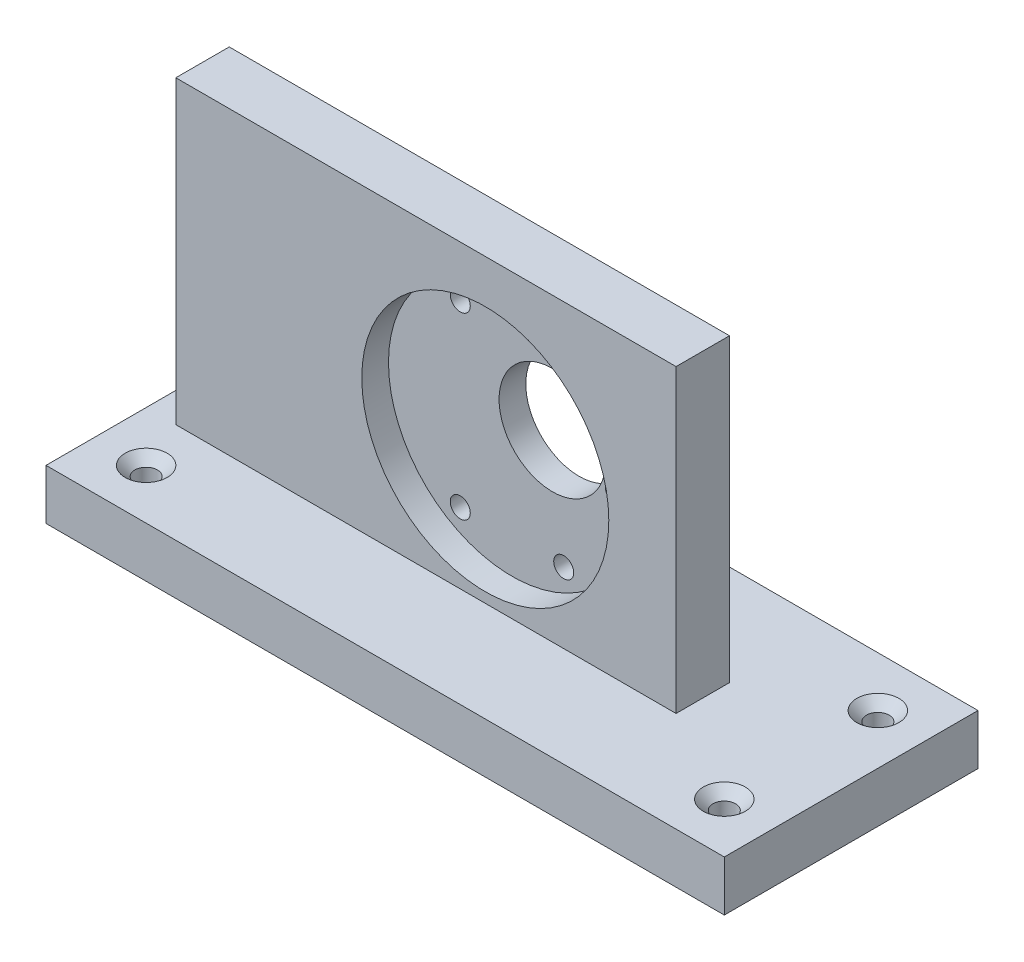
ISO-10303-21;
HEADER;
FILE_DESCRIPTION(('STEP AP214'),'2;1');
FILE_NAME('part.step','',(''),(''),'','','');
FILE_SCHEMA(('AUTOMOTIVE_DESIGN { 1 0 10303 214 1 1 1 1 }'));
ENDSEC;
DATA;
#1=APPLICATION_CONTEXT('core data for automotive mechanical design processes');
#2=APPLICATION_PROTOCOL_DEFINITION('international standard','automotive_design',2000,#1);
#3=PRODUCT_CONTEXT('',#1,'mechanical');
#4=PRODUCT('Part','Part','',(#3));
#5=PRODUCT_RELATED_PRODUCT_CATEGORY('part','',(#4));
#6=PRODUCT_DEFINITION_FORMATION('','',#4);
#7=PRODUCT_DEFINITION_CONTEXT('part definition',#1,'design');
#8=PRODUCT_DEFINITION('design','',#6,#7);
#9=PRODUCT_DEFINITION_SHAPE('','',#8);
#10=(LENGTH_UNIT() NAMED_UNIT(*) SI_UNIT(.MILLI.,.METRE.));
#11=(NAMED_UNIT(*) PLANE_ANGLE_UNIT() SI_UNIT($,.RADIAN.));
#12=(NAMED_UNIT(*) SI_UNIT($,.STERADIAN.) SOLID_ANGLE_UNIT());
#13=UNCERTAINTY_MEASURE_WITH_UNIT(LENGTH_MEASURE(1.E-05),#10,'distance_accuracy_value','');
#14=(GEOMETRIC_REPRESENTATION_CONTEXT(3) GLOBAL_UNCERTAINTY_ASSIGNED_CONTEXT((#13)) GLOBAL_UNIT_ASSIGNED_CONTEXT((#10,
#11,#12)) REPRESENTATION_CONTEXT('',''));
#15=CARTESIAN_POINT('',(0.,0.,0.));
#16=DIRECTION('',(0.,0.,1.));
#17=DIRECTION('',(1.,0.,0.));
#18=AXIS2_PLACEMENT_3D('',#15,#16,#17);
#19=CARTESIAN_POINT('',(-50.8,5.,23.));
#20=DIRECTION('',(0.,-1.,0.));
#21=DIRECTION('',(1.,0.,0.));
#22=AXIS2_PLACEMENT_3D('',#19,#20,#21);
#23=PLANE('',#22);
#24=DIRECTION('',(-1.,0.,0.));
#25=VECTOR('',#24,1.);
#26=CARTESIAN_POINT('',(-50.8,5.,-15.));
#27=LINE('',#26,#25);
#28=CARTESIAN_POINT('',(50.8,5.00000000000002,-15.));
#29=VERTEX_POINT('',#28);
#30=CARTESIAN_POINT('',(-25.7177120902274,5.00000000000001,-15.));
#31=VERTEX_POINT('',#30);
#32=EDGE_CURVE('E285',#29,#31,#27,.T.);
#33=ORIENTED_EDGE('',*,*,#32,.T.);
#34=DIRECTION('',(0.,0.,-1.));
#35=VECTOR('',#34,1.);
#36=CARTESIAN_POINT('',(-25.7177120902274,5.00000000000001,-15.));
#37=LINE('',#36,#35);
#38=CARTESIAN_POINT('',(-25.7177120902274,5.00000000000001,-3.01915184565478));
#39=VERTEX_POINT('',#38);
#40=EDGE_CURVE('E235',#39,#31,#37,.T.);
#41=ORIENTED_EDGE('',*,*,#40,.F.);
#42=DIRECTION('',(1.,0.,0.));
#43=VECTOR('',#42,1.);
#44=CARTESIAN_POINT('',(-50.8,5.,-3.01915184565478));
#45=LINE('',#44,#43);
#46=CARTESIAN_POINT('',(-50.8,5.,-3.01915184565478));
#47=VERTEX_POINT('',#46);
#48=EDGE_CURVE('E166',#47,#39,#45,.T.);
#49=ORIENTED_EDGE('',*,*,#48,.F.);
#50=DIRECTION('',(0.,0.,-1.));
#51=VECTOR('',#50,1.);
#52=CARTESIAN_POINT('',(-50.8,5.,23.));
#53=LINE('',#52,#51);
#54=CARTESIAN_POINT('',(-50.8,5.,23.));
#55=VERTEX_POINT('',#54);
#56=EDGE_CURVE('E298',#55,#47,#53,.T.);
#57=ORIENTED_EDGE('',*,*,#56,.F.);
#58=DIRECTION('',(-1.,0.,0.));
#59=VECTOR('',#58,1.);
#60=CARTESIAN_POINT('',(-50.8,5.,23.));
#61=LINE('',#60,#59);
#62=CARTESIAN_POINT('',(50.8,5.00000000000002,23.));
#63=VERTEX_POINT('',#62);
#64=EDGE_CURVE('E295',#63,#55,#61,.T.);
#65=ORIENTED_EDGE('',*,*,#64,.F.);
#66=DIRECTION('',(0.,0.,-1.));
#67=VECTOR('',#66,1.);
#68=CARTESIAN_POINT('',(50.8,5.00000000000002,23.));
#69=LINE('',#68,#67);
#70=EDGE_CURVE('E302',#63,#29,#69,.T.);
#71=ORIENTED_EDGE('',*,*,#70,.T.);
#72=EDGE_LOOP('',(#33,#41,#49,#57,#65,#71));
#73=FACE_BOUND('',#72,.T.);
#74=CARTESIAN_POINT('',(43.3,5.00000000000002,-7.50000000000001));
#75=DIRECTION('',(0.,1.,0.));
#76=DIRECTION('',(0.,0.,1.));
#77=AXIS2_PLACEMENT_3D('',#74,#75,#76);
#78=CIRCLE('',#77,3.15);
#79=CARTESIAN_POINT('',(43.3,5.00000000000002,-4.35000000000001));
#80=VERTEX_POINT('',#79);
#81=EDGE_CURVE('E269',#80,#80,#78,.T.);
#82=ORIENTED_EDGE('',*,*,#81,.F.);
#83=EDGE_LOOP('',(#82));
#84=FACE_BOUND('',#83,.T.);
#85=CARTESIAN_POINT('',(43.3,5.00000000000002,15.5));
#86=DIRECTION('',(0.,1.,0.));
#87=DIRECTION('',(0.,0.,1.));
#88=AXIS2_PLACEMENT_3D('',#85,#86,#87);
#89=CIRCLE('',#88,3.15);
#90=CARTESIAN_POINT('',(43.3,5.00000000000002,18.65));
#91=VERTEX_POINT('',#90);
#92=EDGE_CURVE('E257',#91,#91,#89,.T.);
#93=ORIENTED_EDGE('',*,*,#92,.F.);
#94=EDGE_LOOP('',(#93));
#95=FACE_BOUND('',#94,.T.);
#96=CARTESIAN_POINT('',(-43.3,5.,15.5));
#97=DIRECTION('',(0.,1.,0.));
#98=DIRECTION('',(0.,0.,1.));
#99=AXIS2_PLACEMENT_3D('',#96,#97,#98);
#100=CIRCLE('',#99,3.15);
#101=CARTESIAN_POINT('',(-43.3,5.,18.65));
#102=VERTEX_POINT('',#101);
#103=EDGE_CURVE('E245',#102,#102,#100,.T.);
#104=ORIENTED_EDGE('',*,*,#103,.F.);
#105=EDGE_LOOP('',(#104));
#106=FACE_BOUND('',#105,.T.);
#107=DIRECTION('',(0.,0.,1.));
#108=VECTOR('',#107,1.);
#109=CARTESIAN_POINT('',(-46.355,5.,8.));
#110=LINE('',#109,#108);
#111=CARTESIAN_POINT('',(-46.355,5.,0.));
#112=VERTEX_POINT('',#111);
#113=CARTESIAN_POINT('',(-46.355,5.,8.));
#114=VERTEX_POINT('',#113);
#115=EDGE_CURVE('E215',#112,#114,#110,.T.);
#116=ORIENTED_EDGE('',*,*,#115,.F.);
#117=DIRECTION('',(-1.,0.,0.));
#118=VECTOR('',#117,1.);
#119=CARTESIAN_POINT('',(0.,5.00000000000001,0.));
#120=LINE('',#119,#118);
#121=CARTESIAN_POINT('',(28.575,5.00000000000002,0.));
#122=VERTEX_POINT('',#121);
#123=EDGE_CURVE('E91',#122,#112,#120,.T.);
#124=ORIENTED_EDGE('',*,*,#123,.F.);
#125=DIRECTION('',(0.,0.,-1.));
#126=VECTOR('',#125,1.);
#127=CARTESIAN_POINT('',(28.575,5.00000000000001,8.));
#128=LINE('',#127,#126);
#129=CARTESIAN_POINT('',(28.575,5.00000000000001,8.));
#130=VERTEX_POINT('',#129);
#131=EDGE_CURVE('E305',#130,#122,#128,.T.);
#132=ORIENTED_EDGE('',*,*,#131,.F.);
#133=DIRECTION('',(-1.,0.,0.));
#134=VECTOR('',#133,1.);
#135=CARTESIAN_POINT('',(0.,5.00000000000001,8.));
#136=LINE('',#135,#134);
#137=EDGE_CURVE('E98',#130,#114,#136,.T.);
#138=ORIENTED_EDGE('',*,*,#137,.T.);
#139=EDGE_LOOP('',(#116,#124,#132,#138));
#140=FACE_BOUND('',#139,.T.);
#141=ADVANCED_FACE('F74',(#73,#84,#95,#106,#140),#23,.F.);
#142=CARTESIAN_POINT('',(28.575,50.,8.));
#143=DIRECTION('',(1.,0.,0.));
#144=DIRECTION('',(0.,1.,0.));
#145=AXIS2_PLACEMENT_3D('',#142,#143,#144);
#146=PLANE('',#145);
#147=DIRECTION('',(0.,-1.,0.));
#148=VECTOR('',#147,1.);
#149=CARTESIAN_POINT('',(28.575,50.,8.));
#150=LINE('',#149,#148);
#151=CARTESIAN_POINT('',(28.575,50.,8.));
#152=VERTEX_POINT('',#151);
#153=EDGE_CURVE('E369',#152,#130,#150,.T.);
#154=ORIENTED_EDGE('',*,*,#153,.T.);
#155=ORIENTED_EDGE('',*,*,#131,.T.);
#156=DIRECTION('',(0.,-1.,0.));
#157=VECTOR('',#156,1.);
#158=CARTESIAN_POINT('',(28.575,50.,0.));
#159=LINE('',#158,#157);
#160=CARTESIAN_POINT('',(28.575,50.,0.));
#161=VERTEX_POINT('',#160);
#162=EDGE_CURVE('E370',#161,#122,#159,.T.);
#163=ORIENTED_EDGE('',*,*,#162,.F.);
#164=DIRECTION('',(0.,0.,-1.));
#165=VECTOR('',#164,1.);
#166=CARTESIAN_POINT('',(28.575,50.,8.));
#167=LINE('',#166,#165);
#168=EDGE_CURVE('E374',#152,#161,#167,.T.);
#169=ORIENTED_EDGE('',*,*,#168,.F.);
#170=EDGE_LOOP('',(#154,#155,#163,#169));
#171=FACE_BOUND('',#170,.T.);
#172=ADVANCED_FACE('F445',(#171),#146,.T.);
#173=CARTESIAN_POINT('',(0.,0.,8.));
#174=DIRECTION('',(0.,0.,-1.));
#175=DIRECTION('',(-1.,0.,0.));
#176=AXIS2_PLACEMENT_3D('',#173,#174,#175);
#177=PLANE('',#176);
#178=CARTESIAN_POINT('',(0.,25.,8.));
#179=DIRECTION('',(0.,0.,1.));
#180=DIRECTION('',(1.,0.,0.));
#181=AXIS2_PLACEMENT_3D('',#178,#179,#180);
#182=CIRCLE('',#181,18.5);
#183=CARTESIAN_POINT('',(18.5,25.,8.));
#184=VERTEX_POINT('',#183);
#185=EDGE_CURVE('E311',#184,#184,#182,.T.);
#186=ORIENTED_EDGE('',*,*,#185,.F.);
#187=EDGE_LOOP('',(#186));
#188=FACE_BOUND('',#187,.T.);
#189=ORIENTED_EDGE('',*,*,#137,.F.);
#190=ORIENTED_EDGE('',*,*,#153,.F.);
#191=DIRECTION('',(1.,0.,0.));
#192=VECTOR('',#191,1.);
#193=CARTESIAN_POINT('',(-28.575,50.,8.));
#194=LINE('',#193,#192);
#195=CARTESIAN_POINT('',(-46.355,50.,8.));
#196=VERTEX_POINT('',#195);
#197=EDGE_CURVE('E365',#196,#152,#194,.T.);
#198=ORIENTED_EDGE('',*,*,#197,.F.);
#199=DIRECTION('',(0.,-1.,0.));
#200=VECTOR('',#199,1.);
#201=CARTESIAN_POINT('',(-46.355,50.,8.));
#202=LINE('',#201,#200);
#203=EDGE_CURVE('E223',#196,#114,#202,.T.);
#204=ORIENTED_EDGE('',*,*,#203,.T.);
#205=EDGE_LOOP('',(#189,#190,#198,#204));
#206=FACE_BOUND('',#205,.T.);
#207=ADVANCED_FACE('F487',(#188,#206),#177,.F.);
#208=CARTESIAN_POINT('',(0.,0.,0.));
#209=DIRECTION('',(0.,0.,-1.));
#210=DIRECTION('',(-1.,0.,0.));
#211=AXIS2_PLACEMENT_3D('',#208,#209,#210);
#212=PLANE('',#211);
#213=CARTESIAN_POINT('',(-38.1178222066704,28.4999999993294,0.));
#214=DIRECTION('',(0.,0.,-1.));
#215=DIRECTION('',(-1.,0.,0.));
#216=AXIS2_PLACEMENT_3D('',#213,#214,#215);
#217=CIRCLE('',#216,6.7056);
#218=CARTESIAN_POINT('',(-44.8234222066704,28.4999999993294,0.));
#219=VERTEX_POINT('',#218);
#220=EDGE_CURVE('E206',#219,#219,#217,.T.);
#221=ORIENTED_EDGE('',*,*,#220,.F.);
#222=EDGE_LOOP('',(#221));
#223=FACE_BOUND('',#222,.T.);
#224=CARTESIAN_POINT('',(-7.74999999999999,38.4233937586588,0.));
#225=DIRECTION('',(0.,0.,1.));
#226=DIRECTION('',(1.,0.,0.));
#227=AXIS2_PLACEMENT_3D('',#224,#225,#226);
#228=CIRCLE('',#227,1.50000000039213);
#229=CARTESIAN_POINT('',(-6.24999999960786,38.4233937586588,0.));
#230=VERTEX_POINT('',#229);
#231=EDGE_CURVE('E345',#230,#230,#228,.T.);
#232=ORIENTED_EDGE('',*,*,#231,.T.);
#233=EDGE_LOOP('',(#232));
#234=FACE_BOUND('',#233,.T.);
#235=CARTESIAN_POINT('',(-7.74999999999999,11.5766062413412,0.));
#236=DIRECTION('',(0.,0.,1.));
#237=DIRECTION('',(1.,0.,0.));
#238=AXIS2_PLACEMENT_3D('',#235,#236,#237);
#239=CIRCLE('',#238,1.50000000039213);
#240=CARTESIAN_POINT('',(-6.24999999960786,11.5766062413412,0.));
#241=VERTEX_POINT('',#240);
#242=EDGE_CURVE('E350',#241,#241,#239,.T.);
#243=ORIENTED_EDGE('',*,*,#242,.T.);
#244=EDGE_LOOP('',(#243));
#245=FACE_BOUND('',#244,.T.);
#246=CARTESIAN_POINT('',(7.75000000000001,11.5766062413412,0.));
#247=DIRECTION('',(0.,0.,1.));
#248=DIRECTION('',(1.,0.,0.));
#249=AXIS2_PLACEMENT_3D('',#246,#247,#248);
#250=CIRCLE('',#249,1.50000000039213);
#251=CARTESIAN_POINT('',(9.25000000039214,11.5766062413412,0.));
#252=VERTEX_POINT('',#251);
#253=EDGE_CURVE('E354',#252,#252,#250,.T.);
#254=ORIENTED_EDGE('',*,*,#253,.T.);
#255=EDGE_LOOP('',(#254));
#256=FACE_BOUND('',#255,.T.);
#257=CARTESIAN_POINT('',(15.5,25.,0.));
#258=DIRECTION('',(0.,0.,1.));
#259=DIRECTION('',(1.,0.,0.));
#260=AXIS2_PLACEMENT_3D('',#257,#258,#259);
#261=CIRCLE('',#260,1.50000000039213);
#262=CARTESIAN_POINT('',(17.0000000003921,25.,0.));
#263=VERTEX_POINT('',#262);
#264=EDGE_CURVE('E344',#263,#263,#261,.T.);
#265=ORIENTED_EDGE('',*,*,#264,.T.);
#266=EDGE_LOOP('',(#265));
#267=FACE_BOUND('',#266,.T.);
#268=CARTESIAN_POINT('',(6.06217782532956,28.4999999993294,0.));
#269=DIRECTION('',(0.,0.,1.));
#270=DIRECTION('',(1.,0.,0.));
#271=AXIS2_PLACEMENT_3D('',#268,#269,#270);
#272=CIRCLE('',#271,8.00000000000001);
#273=CARTESIAN_POINT('',(14.0621778253296,28.4999999993294,0.));
#274=VERTEX_POINT('',#273);
#275=EDGE_CURVE('E340',#274,#274,#272,.T.);
#276=ORIENTED_EDGE('',*,*,#275,.T.);
#277=EDGE_LOOP('',(#276));
#278=FACE_BOUND('',#277,.T.);
#279=CARTESIAN_POINT('',(7.74999999999999,38.4233937586588,0.));
#280=DIRECTION('',(0.,0.,1.));
#281=DIRECTION('',(1.,0.,0.));
#282=AXIS2_PLACEMENT_3D('',#279,#280,#281);
#283=CIRCLE('',#282,1.50000000039214);
#284=CARTESIAN_POINT('',(9.25000000039213,38.4233937586588,0.));
#285=VERTEX_POINT('',#284);
#286=EDGE_CURVE('E349',#285,#285,#283,.T.);
#287=ORIENTED_EDGE('',*,*,#286,.T.);
#288=EDGE_LOOP('',(#287));
#289=FACE_BOUND('',#288,.T.);
#290=ORIENTED_EDGE('',*,*,#162,.T.);
#291=ORIENTED_EDGE('',*,*,#123,.T.);
#292=DIRECTION('',(0.,-1.,0.));
#293=VECTOR('',#292,1.);
#294=CARTESIAN_POINT('',(-46.355,50.,0.));
#295=LINE('',#294,#293);
#296=CARTESIAN_POINT('',(-46.355,50.,0.));
#297=VERTEX_POINT('',#296);
#298=EDGE_CURVE('E229',#297,#112,#295,.T.);
#299=ORIENTED_EDGE('',*,*,#298,.F.);
#300=DIRECTION('',(1.,0.,0.));
#301=VECTOR('',#300,1.);
#302=CARTESIAN_POINT('',(-28.575,50.,0.));
#303=LINE('',#302,#301);
#304=EDGE_CURVE('E364',#297,#161,#303,.T.);
#305=ORIENTED_EDGE('',*,*,#304,.T.);
#306=EDGE_LOOP('',(#290,#291,#299,#305));
#307=FACE_BOUND('',#306,.T.);
#308=ADVANCED_FACE('F485',(#223,#234,#245,#256,#267,#278,#289,#307),#212,.T.);
#309=CARTESIAN_POINT('',(7.74999999999999,38.4233937586588,10.));
#310=DIRECTION('',(0.,0.,-1.));
#311=DIRECTION('',(-1.,0.,0.));
#312=AXIS2_PLACEMENT_3D('',#309,#310,#311);
#313=CYLINDRICAL_SURFACE('',#312,1.50000000039214);
#314=ORIENTED_EDGE('',*,*,#286,.F.);
#315=EDGE_LOOP('',(#314));
#316=FACE_BOUND('',#315,.T.);
#317=CARTESIAN_POINT('',(7.74999999999999,38.4233937586588,4.));
#318=DIRECTION('',(0.,0.,1.));
#319=DIRECTION('',(1.,0.,0.));
#320=AXIS2_PLACEMENT_3D('',#317,#318,#319);
#321=CIRCLE('',#320,1.50000000039214);
#322=CARTESIAN_POINT('',(9.25000000039213,38.4233937586588,4.));
#323=VERTEX_POINT('',#322);
#324=EDGE_CURVE('E336',#323,#323,#321,.T.);
#325=ORIENTED_EDGE('',*,*,#324,.T.);
#326=EDGE_LOOP('',(#325));
#327=FACE_BOUND('',#326,.T.);
#328=ADVANCED_FACE('F466',(#316,#327),#313,.F.);
#329=CARTESIAN_POINT('',(6.06217782532956,28.4999999993294,10.));
#330=DIRECTION('',(0.,0.,-1.));
#331=DIRECTION('',(-1.,0.,0.));
#332=AXIS2_PLACEMENT_3D('',#329,#330,#331);
#333=CYLINDRICAL_SURFACE('',#332,8.00000000000001);
#334=ORIENTED_EDGE('',*,*,#275,.F.);
#335=EDGE_LOOP('',(#334));
#336=FACE_BOUND('',#335,.T.);
#337=CARTESIAN_POINT('',(6.06217782532956,28.4999999993294,4.));
#338=DIRECTION('',(0.,0.,1.));
#339=DIRECTION('',(1.,0.,0.));
#340=AXIS2_PLACEMENT_3D('',#337,#338,#339);
#341=CIRCLE('',#340,8.00000000000001);
#342=CARTESIAN_POINT('',(14.0621778253296,28.4999999993294,4.));
#343=VERTEX_POINT('',#342);
#344=EDGE_CURVE('E332',#343,#343,#341,.T.);
#345=ORIENTED_EDGE('',*,*,#344,.T.);
#346=EDGE_LOOP('',(#345));
#347=FACE_BOUND('',#346,.T.);
#348=ADVANCED_FACE('F462',(#336,#347),#333,.F.);
#349=CARTESIAN_POINT('',(15.5,25.,10.));
#350=DIRECTION('',(0.,0.,-1.));
#351=DIRECTION('',(-1.,0.,0.));
#352=AXIS2_PLACEMENT_3D('',#349,#350,#351);
#353=CYLINDRICAL_SURFACE('',#352,1.50000000039213);
#354=ORIENTED_EDGE('',*,*,#264,.F.);
#355=EDGE_LOOP('',(#354));
#356=FACE_BOUND('',#355,.T.);
#357=CARTESIAN_POINT('',(15.5,25.,4.));
#358=DIRECTION('',(0.,0.,1.));
#359=DIRECTION('',(1.,0.,0.));
#360=AXIS2_PLACEMENT_3D('',#357,#358,#359);
#361=CIRCLE('',#360,1.50000000039213);
#362=CARTESIAN_POINT('',(17.0000000003921,25.,4.));
#363=VERTEX_POINT('',#362);
#364=EDGE_CURVE('E328',#363,#363,#361,.T.);
#365=ORIENTED_EDGE('',*,*,#364,.T.);
#366=EDGE_LOOP('',(#365));
#367=FACE_BOUND('',#366,.T.);
#368=ADVANCED_FACE('F465',(#356,#367),#353,.F.);
#369=CARTESIAN_POINT('',(7.75000000000001,11.5766062413412,10.));
#370=DIRECTION('',(0.,0.,-1.));
#371=DIRECTION('',(-1.,0.,0.));
#372=AXIS2_PLACEMENT_3D('',#369,#370,#371);
#373=CYLINDRICAL_SURFACE('',#372,1.50000000039213);
#374=ORIENTED_EDGE('',*,*,#253,.F.);
#375=EDGE_LOOP('',(#374));
#376=FACE_BOUND('',#375,.T.);
#377=CARTESIAN_POINT('',(7.75000000000001,11.5766062413412,4.));
#378=DIRECTION('',(0.,0.,1.));
#379=DIRECTION('',(1.,0.,0.));
#380=AXIS2_PLACEMENT_3D('',#377,#378,#379);
#381=CIRCLE('',#380,1.50000000039213);
#382=CARTESIAN_POINT('',(9.25000000039214,11.5766062413412,4.));
#383=VERTEX_POINT('',#382);
#384=EDGE_CURVE('E324',#383,#383,#381,.T.);
#385=ORIENTED_EDGE('',*,*,#384,.T.);
#386=EDGE_LOOP('',(#385));
#387=FACE_BOUND('',#386,.T.);
#388=ADVANCED_FACE('F475',(#376,#387),#373,.F.);
#389=CARTESIAN_POINT('',(-7.74999999999999,11.5766062413412,10.));
#390=DIRECTION('',(0.,0.,-1.));
#391=DIRECTION('',(-1.,0.,0.));
#392=AXIS2_PLACEMENT_3D('',#389,#390,#391);
#393=CYLINDRICAL_SURFACE('',#392,1.50000000039213);
#394=ORIENTED_EDGE('',*,*,#242,.F.);
#395=EDGE_LOOP('',(#394));
#396=FACE_BOUND('',#395,.T.);
#397=CARTESIAN_POINT('',(-7.74999999999999,11.5766062413412,4.));
#398=DIRECTION('',(0.,0.,1.));
#399=DIRECTION('',(1.,0.,0.));
#400=AXIS2_PLACEMENT_3D('',#397,#398,#399);
#401=CIRCLE('',#400,1.50000000039213);
#402=CARTESIAN_POINT('',(-6.24999999960786,11.5766062413412,4.));
#403=VERTEX_POINT('',#402);
#404=EDGE_CURVE('E320',#403,#403,#401,.T.);
#405=ORIENTED_EDGE('',*,*,#404,.T.);
#406=EDGE_LOOP('',(#405));
#407=FACE_BOUND('',#406,.T.);
#408=ADVANCED_FACE('F471',(#396,#407),#393,.F.);
#409=CARTESIAN_POINT('',(-7.74999999999999,38.4233937586588,10.));
#410=DIRECTION('',(0.,0.,-1.));
#411=DIRECTION('',(-1.,0.,0.));
#412=AXIS2_PLACEMENT_3D('',#409,#410,#411);
#413=CYLINDRICAL_SURFACE('',#412,1.50000000039213);
#414=ORIENTED_EDGE('',*,*,#231,.F.);
#415=EDGE_LOOP('',(#414));
#416=FACE_BOUND('',#415,.T.);
#417=CARTESIAN_POINT('',(-7.74999999999999,38.4233937586588,4.));
#418=DIRECTION('',(0.,0.,1.));
#419=DIRECTION('',(1.,0.,0.));
#420=AXIS2_PLACEMENT_3D('',#417,#418,#419);
#421=CIRCLE('',#420,1.50000000039213);
#422=CARTESIAN_POINT('',(-6.24999999960786,38.4233937586588,4.));
#423=VERTEX_POINT('',#422);
#424=EDGE_CURVE('E316',#423,#423,#421,.T.);
#425=ORIENTED_EDGE('',*,*,#424,.T.);
#426=EDGE_LOOP('',(#425));
#427=FACE_BOUND('',#426,.T.);
#428=ADVANCED_FACE('F468',(#416,#427),#413,.F.);
#429=CARTESIAN_POINT('',(-28.575,50.,8.));
#430=DIRECTION('',(0.,1.,0.));
#431=DIRECTION('',(-1.,0.,0.));
#432=AXIS2_PLACEMENT_3D('',#429,#430,#431);
#433=PLANE('',#432);
#434=ORIENTED_EDGE('',*,*,#304,.F.);
#435=DIRECTION('',(0.,0.,1.));
#436=VECTOR('',#435,1.);
#437=CARTESIAN_POINT('',(-46.355,50.,8.));
#438=LINE('',#437,#436);
#439=EDGE_CURVE('E219',#297,#196,#438,.T.);
#440=ORIENTED_EDGE('',*,*,#439,.T.);
#441=ORIENTED_EDGE('',*,*,#197,.T.);
#442=ORIENTED_EDGE('',*,*,#168,.T.);
#443=EDGE_LOOP('',(#434,#440,#441,#442));
#444=FACE_BOUND('',#443,.T.);
#445=ADVANCED_FACE('F76',(#444),#433,.T.);
#446=CARTESIAN_POINT('',(0.,25.,4.));
#447=DIRECTION('',(0.,0.,1.));
#448=DIRECTION('',(1.,0.,0.));
#449=AXIS2_PLACEMENT_3D('',#446,#447,#448);
#450=CYLINDRICAL_SURFACE('',#449,18.5);
#451=CARTESIAN_POINT('',(0.,25.,4.));
#452=DIRECTION('',(0.,0.,1.));
#453=DIRECTION('',(1.,0.,0.));
#454=AXIS2_PLACEMENT_3D('',#451,#452,#453);
#455=CIRCLE('',#454,18.5);
#456=CARTESIAN_POINT('',(18.5,25.,4.));
#457=VERTEX_POINT('',#456);
#458=EDGE_CURVE('E312',#457,#457,#455,.T.);
#459=ORIENTED_EDGE('',*,*,#458,.F.);
#460=EDGE_LOOP('',(#459));
#461=FACE_BOUND('',#460,.T.);
#462=ORIENTED_EDGE('',*,*,#185,.T.);
#463=EDGE_LOOP('',(#462));
#464=FACE_BOUND('',#463,.T.);
#465=ADVANCED_FACE('F457',(#461,#464),#450,.F.);
#466=CARTESIAN_POINT('',(0.,25.,4.));
#467=DIRECTION('',(0.,0.,1.));
#468=DIRECTION('',(1.,0.,0.));
#469=AXIS2_PLACEMENT_3D('',#466,#467,#468);
#470=PLANE('',#469);
#471=ORIENTED_EDGE('',*,*,#324,.F.);
#472=EDGE_LOOP('',(#471));
#473=FACE_BOUND('',#472,.T.);
#474=ORIENTED_EDGE('',*,*,#344,.F.);
#475=EDGE_LOOP('',(#474));
#476=FACE_BOUND('',#475,.T.);
#477=ORIENTED_EDGE('',*,*,#364,.F.);
#478=EDGE_LOOP('',(#477));
#479=FACE_BOUND('',#478,.T.);
#480=ORIENTED_EDGE('',*,*,#384,.F.);
#481=EDGE_LOOP('',(#480));
#482=FACE_BOUND('',#481,.T.);
#483=ORIENTED_EDGE('',*,*,#404,.F.);
#484=EDGE_LOOP('',(#483));
#485=FACE_BOUND('',#484,.T.);
#486=ORIENTED_EDGE('',*,*,#424,.F.);
#487=EDGE_LOOP('',(#486));
#488=FACE_BOUND('',#487,.T.);
#489=ORIENTED_EDGE('',*,*,#458,.T.);
#490=EDGE_LOOP('',(#489));
#491=FACE_BOUND('',#490,.T.);
#492=ADVANCED_FACE('F453',(#473,#476,#479,#482,#485,#488,#491),#470,.T.);
#493=CARTESIAN_POINT('',(-50.8,5.,23.));
#494=DIRECTION('',(1.,0.,0.));
#495=DIRECTION('',(0.,0.,-1.));
#496=AXIS2_PLACEMENT_3D('',#493,#494,#495);
#497=PLANE('',#496);
#498=ORIENTED_EDGE('',*,*,#56,.T.);
#499=DIRECTION('',(0.,1.,0.));
#500=VECTOR('',#499,1.);
#501=CARTESIAN_POINT('',(-50.8,-0.00100000000003569,-3.01915184565478));
#502=LINE('',#501,#500);
#503=CARTESIAN_POINT('',(-50.8,-2.54000000000001,-3.01915184565478));
#504=VERTEX_POINT('',#503);
#505=EDGE_CURVE('E171',#504,#47,#502,.T.);
#506=ORIENTED_EDGE('',*,*,#505,.F.);
#507=DIRECTION('',(0.,0.,-1.));
#508=VECTOR('',#507,1.);
#509=CARTESIAN_POINT('',(-50.8,-2.54000000000001,-3.01915184565478));
#510=LINE('',#509,#508);
#511=CARTESIAN_POINT('',(-50.8,-2.54000000000001,23.));
#512=VERTEX_POINT('',#511);
#513=EDGE_CURVE('E187',#512,#504,#510,.T.);
#514=ORIENTED_EDGE('',*,*,#513,.F.);
#515=DIRECTION('',(0.,-1.,0.));
#516=VECTOR('',#515,1.);
#517=CARTESIAN_POINT('',(-50.8,5.,23.));
#518=LINE('',#517,#516);
#519=EDGE_CURVE('E289',#55,#512,#518,.T.);
#520=ORIENTED_EDGE('',*,*,#519,.F.);
#521=EDGE_LOOP('',(#498,#506,#514,#520));
#522=FACE_BOUND('',#521,.T.);
#523=ADVANCED_FACE('F449',(#522),#497,.F.);
#524=CARTESIAN_POINT('',(50.8,5.00000000000002,23.));
#525=DIRECTION('',(-1.,0.,0.));
#526=DIRECTION('',(0.,0.,1.));
#527=AXIS2_PLACEMENT_3D('',#524,#525,#526);
#528=PLANE('',#527);
#529=DIRECTION('',(0.,1.,0.));
#530=VECTOR('',#529,1.);
#531=CARTESIAN_POINT('',(50.8,5.00000000000002,23.));
#532=LINE('',#531,#530);
#533=CARTESIAN_POINT('',(50.8,-2.53999999999999,23.));
#534=VERTEX_POINT('',#533);
#535=EDGE_CURVE('E292',#534,#63,#532,.T.);
#536=ORIENTED_EDGE('',*,*,#535,.F.);
#537=DIRECTION('',(0.,0.,1.));
#538=VECTOR('',#537,1.);
#539=CARTESIAN_POINT('',(50.8,-2.53999999999999,23.));
#540=LINE('',#539,#538);
#541=CARTESIAN_POINT('',(50.8,-2.53999999999999,-15.));
#542=VERTEX_POINT('',#541);
#543=EDGE_CURVE('E193',#542,#534,#540,.T.);
#544=ORIENTED_EDGE('',*,*,#543,.F.);
#545=DIRECTION('',(0.,1.,0.));
#546=VECTOR('',#545,1.);
#547=CARTESIAN_POINT('',(50.8,5.00000000000002,-15.));
#548=LINE('',#547,#546);
#549=EDGE_CURVE('E281',#542,#29,#548,.T.);
#550=ORIENTED_EDGE('',*,*,#549,.T.);
#551=ORIENTED_EDGE('',*,*,#70,.F.);
#552=EDGE_LOOP('',(#536,#544,#550,#551));
#553=FACE_BOUND('',#552,.T.);
#554=ADVANCED_FACE('F441',(#553),#528,.F.);
#555=CARTESIAN_POINT('',(0.,0.,23.));
#556=DIRECTION('',(0.,0.,1.));
#557=DIRECTION('',(1.,0.,0.));
#558=AXIS2_PLACEMENT_3D('',#555,#556,#557);
#559=PLANE('',#558);
#560=ORIENTED_EDGE('',*,*,#519,.T.);
#561=DIRECTION('',(-1.,0.,0.));
#562=VECTOR('',#561,1.);
#563=CARTESIAN_POINT('',(-50.8,-2.54000000000001,23.));
#564=LINE('',#563,#562);
#565=EDGE_CURVE('E197',#534,#512,#564,.T.);
#566=ORIENTED_EDGE('',*,*,#565,.F.);
#567=ORIENTED_EDGE('',*,*,#535,.T.);
#568=ORIENTED_EDGE('',*,*,#64,.T.);
#569=EDGE_LOOP('',(#560,#566,#567,#568));
#570=FACE_BOUND('',#569,.T.);
#571=ADVANCED_FACE('F437',(#570),#559,.T.);
#572=CARTESIAN_POINT('',(0.,0.,-15.));
#573=DIRECTION('',(0.,0.,1.));
#574=DIRECTION('',(1.,0.,0.));
#575=AXIS2_PLACEMENT_3D('',#572,#573,#574);
#576=PLANE('',#575);
#577=ORIENTED_EDGE('',*,*,#549,.F.);
#578=DIRECTION('',(1.,0.,0.));
#579=VECTOR('',#578,1.);
#580=CARTESIAN_POINT('',(50.8,-2.53999999999999,-15.));
#581=LINE('',#580,#579);
#582=CARTESIAN_POINT('',(-25.7177120902274,-2.54,-15.));
#583=VERTEX_POINT('',#582);
#584=EDGE_CURVE('E181',#583,#542,#581,.T.);
#585=ORIENTED_EDGE('',*,*,#584,.F.);
#586=DIRECTION('',(0.,1.,0.));
#587=VECTOR('',#586,1.);
#588=CARTESIAN_POINT('',(-25.7177120902274,-0.00100000000003049,-15.));
#589=LINE('',#588,#587);
#590=EDGE_CURVE('E170',#583,#31,#589,.T.);
#591=ORIENTED_EDGE('',*,*,#590,.T.);
#592=ORIENTED_EDGE('',*,*,#32,.F.);
#593=EDGE_LOOP('',(#577,#585,#591,#592));
#594=FACE_BOUND('',#593,.T.);
#595=ADVANCED_FACE('F433',(#594),#576,.F.);
#596=CARTESIAN_POINT('',(43.3,5.00000000000002,-7.50000000000001));
#597=DIRECTION('',(0.,1.,0.));
#598=DIRECTION('',(0.,0.,1.));
#599=AXIS2_PLACEMENT_3D('',#596,#597,#598);
#600=CYLINDRICAL_SURFACE('',#599,1.69999999999999);
#601=CARTESIAN_POINT('',(43.3,0.,-7.50000000000001));
#602=DIRECTION('',(0.,1.,0.));
#603=DIRECTION('',(0.,0.,1.));
#604=AXIS2_PLACEMENT_3D('',#601,#602,#603);
#605=CIRCLE('',#604,1.69999999999999);
#606=CARTESIAN_POINT('',(43.3,0.,-5.80000000000002));
#607=VERTEX_POINT('',#606);
#608=EDGE_CURVE('E277',#607,#607,#605,.T.);
#609=ORIENTED_EDGE('',*,*,#608,.F.);
#610=EDGE_LOOP('',(#609));
#611=FACE_BOUND('',#610,.T.);
#612=CARTESIAN_POINT('',(43.3,3.55000000000001,-7.50000000000001));
#613=DIRECTION('',(0.,1.,0.));
#614=DIRECTION('',(0.,0.,1.));
#615=AXIS2_PLACEMENT_3D('',#612,#613,#614);
#616=CIRCLE('',#615,1.69999999999999);
#617=CARTESIAN_POINT('',(43.3,3.55000000000001,-5.80000000000002));
#618=VERTEX_POINT('',#617);
#619=EDGE_CURVE('E273',#618,#618,#616,.T.);
#620=ORIENTED_EDGE('',*,*,#619,.T.);
#621=EDGE_LOOP('',(#620));
#622=FACE_BOUND('',#621,.T.);
#623=ADVANCED_FACE('F429',(#611,#622),#600,.F.);
#624=CARTESIAN_POINT('',(43.3,5.00000000000002,-7.50000000000001));
#625=DIRECTION('',(0.,1.,0.));
#626=DIRECTION('',(0.,0.,1.));
#627=AXIS2_PLACEMENT_3D('',#624,#625,#626);
#628=CONICAL_SURFACE('',#627,3.15,0.78539816339745);
#629=ORIENTED_EDGE('',*,*,#619,.F.);
#630=EDGE_LOOP('',(#629));
#631=FACE_BOUND('',#630,.T.);
#632=ORIENTED_EDGE('',*,*,#81,.T.);
#633=EDGE_LOOP('',(#632));
#634=FACE_BOUND('',#633,.T.);
#635=ADVANCED_FACE('F425',(#631,#634),#628,.F.);
#636=CARTESIAN_POINT('',(43.3,5.00000000000002,15.5));
#637=DIRECTION('',(0.,1.,0.));
#638=DIRECTION('',(0.,0.,1.));
#639=AXIS2_PLACEMENT_3D('',#636,#637,#638);
#640=CYLINDRICAL_SURFACE('',#639,1.69999999999999);
#641=CARTESIAN_POINT('',(43.3,0.,15.5));
#642=DIRECTION('',(0.,1.,0.));
#643=DIRECTION('',(0.,0.,1.));
#644=AXIS2_PLACEMENT_3D('',#641,#642,#643);
#645=CIRCLE('',#644,1.69999999999999);
#646=CARTESIAN_POINT('',(43.3,0.,17.2));
#647=VERTEX_POINT('',#646);
#648=EDGE_CURVE('E265',#647,#647,#645,.T.);
#649=ORIENTED_EDGE('',*,*,#648,.F.);
#650=EDGE_LOOP('',(#649));
#651=FACE_BOUND('',#650,.T.);
#652=CARTESIAN_POINT('',(43.3,3.55000000000001,15.5));
#653=DIRECTION('',(0.,1.,0.));
#654=DIRECTION('',(0.,0.,1.));
#655=AXIS2_PLACEMENT_3D('',#652,#653,#654);
#656=CIRCLE('',#655,1.69999999999999);
#657=CARTESIAN_POINT('',(43.3,3.55000000000001,17.2));
#658=VERTEX_POINT('',#657);
#659=EDGE_CURVE('E261',#658,#658,#656,.T.);
#660=ORIENTED_EDGE('',*,*,#659,.T.);
#661=EDGE_LOOP('',(#660));
#662=FACE_BOUND('',#661,.T.);
#663=ADVANCED_FACE('F421',(#651,#662),#640,.F.);
#664=CARTESIAN_POINT('',(43.3,5.00000000000002,15.5));
#665=DIRECTION('',(0.,1.,0.));
#666=DIRECTION('',(0.,0.,1.));
#667=AXIS2_PLACEMENT_3D('',#664,#665,#666);
#668=CONICAL_SURFACE('',#667,3.15,0.78539816339745);
#669=ORIENTED_EDGE('',*,*,#659,.F.);
#670=EDGE_LOOP('',(#669));
#671=FACE_BOUND('',#670,.T.);
#672=ORIENTED_EDGE('',*,*,#92,.T.);
#673=EDGE_LOOP('',(#672));
#674=FACE_BOUND('',#673,.T.);
#675=ADVANCED_FACE('F417',(#671,#674),#668,.F.);
#676=CARTESIAN_POINT('',(-43.3,5.,15.5));
#677=DIRECTION('',(0.,1.,0.));
#678=DIRECTION('',(0.,0.,1.));
#679=AXIS2_PLACEMENT_3D('',#676,#677,#678);
#680=CYLINDRICAL_SURFACE('',#679,1.69999999999999);
#681=CARTESIAN_POINT('',(-43.3,0.,15.5));
#682=DIRECTION('',(0.,1.,0.));
#683=DIRECTION('',(0.,0.,1.));
#684=AXIS2_PLACEMENT_3D('',#681,#682,#683);
#685=CIRCLE('',#684,1.69999999999999);
#686=CARTESIAN_POINT('',(-43.3,0.,17.2));
#687=VERTEX_POINT('',#686);
#688=EDGE_CURVE('E253',#687,#687,#685,.T.);
#689=ORIENTED_EDGE('',*,*,#688,.F.);
#690=EDGE_LOOP('',(#689));
#691=FACE_BOUND('',#690,.T.);
#692=CARTESIAN_POINT('',(-43.3,3.54999999999999,15.5));
#693=DIRECTION('',(0.,1.,0.));
#694=DIRECTION('',(0.,0.,1.));
#695=AXIS2_PLACEMENT_3D('',#692,#693,#694);
#696=CIRCLE('',#695,1.69999999999999);
#697=CARTESIAN_POINT('',(-43.3,3.54999999999999,17.2));
#698=VERTEX_POINT('',#697);
#699=EDGE_CURVE('E249',#698,#698,#696,.T.);
#700=ORIENTED_EDGE('',*,*,#699,.T.);
#701=EDGE_LOOP('',(#700));
#702=FACE_BOUND('',#701,.T.);
#703=ADVANCED_FACE('F413',(#691,#702),#680,.F.);
#704=CARTESIAN_POINT('',(-43.3,5.,15.5));
#705=DIRECTION('',(0.,1.,0.));
#706=DIRECTION('',(0.,0.,1.));
#707=AXIS2_PLACEMENT_3D('',#704,#705,#706);
#708=CONICAL_SURFACE('',#707,3.15,0.78539816339745);
#709=ORIENTED_EDGE('',*,*,#699,.F.);
#710=EDGE_LOOP('',(#709));
#711=FACE_BOUND('',#710,.T.);
#712=ORIENTED_EDGE('',*,*,#103,.T.);
#713=EDGE_LOOP('',(#712));
#714=FACE_BOUND('',#713,.T.);
#715=ADVANCED_FACE('F410',(#711,#714),#708,.F.);
#716=CARTESIAN_POINT('',(-25.7177120902274,-0.00100000000003049,-15.));
#717=DIRECTION('',(1.,0.,0.));
#718=DIRECTION('',(0.,1.,0.));
#719=AXIS2_PLACEMENT_3D('',#716,#717,#718);
#720=PLANE('',#719);
#721=ORIENTED_EDGE('',*,*,#590,.F.);
#722=DIRECTION('',(0.,0.,-1.));
#723=VECTOR('',#722,1.);
#724=CARTESIAN_POINT('',(-25.7177120902274,-2.54,-15.));
#725=LINE('',#724,#723);
#726=CARTESIAN_POINT('',(-25.7177120902274,-2.54,-3.01915184565478));
#727=VERTEX_POINT('',#726);
#728=EDGE_CURVE('E174',#727,#583,#725,.T.);
#729=ORIENTED_EDGE('',*,*,#728,.F.);
#730=DIRECTION('',(0.,1.,0.));
#731=VECTOR('',#730,1.);
#732=CARTESIAN_POINT('',(-25.7177120902274,-0.00100000000003049,-3.01915184565478));
#733=LINE('',#732,#731);
#734=EDGE_CURVE('E160',#727,#39,#733,.T.);
#735=ORIENTED_EDGE('',*,*,#734,.T.);
#736=ORIENTED_EDGE('',*,*,#40,.T.);
#737=EDGE_LOOP('',(#721,#729,#735,#736));
#738=FACE_BOUND('',#737,.T.);
#739=ADVANCED_FACE('F175',(#738),#720,.F.);
#740=CARTESIAN_POINT('',(-50.8,-0.00100000000003569,-3.01915184565478));
#741=DIRECTION('',(0.,0.,1.));
#742=DIRECTION('',(1.,0.,0.));
#743=AXIS2_PLACEMENT_3D('',#740,#741,#742);
#744=PLANE('',#743);
#745=ORIENTED_EDGE('',*,*,#734,.F.);
#746=DIRECTION('',(1.,0.,0.));
#747=VECTOR('',#746,1.);
#748=CARTESIAN_POINT('',(-25.7177120902274,-2.54,-3.01915184565478));
#749=LINE('',#748,#747);
#750=EDGE_CURVE('E164',#504,#727,#749,.T.);
#751=ORIENTED_EDGE('',*,*,#750,.F.);
#752=ORIENTED_EDGE('',*,*,#505,.T.);
#753=ORIENTED_EDGE('',*,*,#48,.T.);
#754=EDGE_LOOP('',(#745,#751,#752,#753));
#755=FACE_BOUND('',#754,.T.);
#756=ADVANCED_FACE('F162',(#755),#744,.F.);
#757=CARTESIAN_POINT('',(-46.355,50.,8.));
#758=DIRECTION('',(1.,0.,0.));
#759=DIRECTION('',(0.,1.,0.));
#760=AXIS2_PLACEMENT_3D('',#757,#758,#759);
#761=PLANE('',#760);
#762=ORIENTED_EDGE('',*,*,#115,.T.);
#763=ORIENTED_EDGE('',*,*,#203,.F.);
#764=ORIENTED_EDGE('',*,*,#439,.F.);
#765=ORIENTED_EDGE('',*,*,#298,.T.);
#766=EDGE_LOOP('',(#762,#763,#764,#765));
#767=FACE_BOUND('',#766,.T.);
#768=ADVANCED_FACE('F504',(#767),#761,.F.);
#769=CARTESIAN_POINT('',(-38.1178222066704,28.4999999993294,-5.08));
#770=DIRECTION('',(0.,0.,1.));
#771=DIRECTION('',(1.,0.,0.));
#772=AXIS2_PLACEMENT_3D('',#769,#770,#771);
#773=CYLINDRICAL_SURFACE('',#772,4.8006);
#774=CARTESIAN_POINT('',(-38.1178222066704,28.4999999993294,-5.08));
#775=DIRECTION('',(0.,0.,-1.));
#776=DIRECTION('',(-1.,0.,0.));
#777=AXIS2_PLACEMENT_3D('',#774,#775,#776);
#778=CIRCLE('',#777,4.8006);
#779=CARTESIAN_POINT('',(-42.9184222066704,28.4999999993294,-5.08));
#780=VERTEX_POINT('',#779);
#781=EDGE_CURVE('E211',#780,#780,#778,.T.);
#782=ORIENTED_EDGE('',*,*,#781,.T.);
#783=EDGE_LOOP('',(#782));
#784=FACE_BOUND('',#783,.T.);
#785=CARTESIAN_POINT('',(-38.1178222066704,28.4999999993294,5.08));
#786=DIRECTION('',(0.,0.,-1.));
#787=DIRECTION('',(-1.,0.,0.));
#788=AXIS2_PLACEMENT_3D('',#785,#786,#787);
#789=CIRCLE('',#788,4.8006);
#790=CARTESIAN_POINT('',(-42.9184222066704,28.4999999993294,5.08));
#791=VERTEX_POINT('',#790);
#792=EDGE_CURVE('E202',#791,#791,#789,.T.);
#793=ORIENTED_EDGE('',*,*,#792,.F.);
#794=EDGE_LOOP('',(#793));
#795=FACE_BOUND('',#794,.T.);
#796=ADVANCED_FACE('F506',(#784,#795),#773,.F.);
#797=CARTESIAN_POINT('',(-38.1178222066704,28.4999999993294,-5.08));
#798=DIRECTION('',(0.,0.,1.));
#799=DIRECTION('',(1.,0.,0.));
#800=AXIS2_PLACEMENT_3D('',#797,#798,#799);
#801=CYLINDRICAL_SURFACE('',#800,6.7056);
#802=CARTESIAN_POINT('',(-38.1178222066704,28.4999999993294,-5.08));
#803=DIRECTION('',(0.,0.,-1.));
#804=DIRECTION('',(-1.,0.,0.));
#805=AXIS2_PLACEMENT_3D('',#802,#803,#804);
#806=CIRCLE('',#805,6.7056);
#807=CARTESIAN_POINT('',(-44.8234222066704,28.4999999993294,-5.08));
#808=VERTEX_POINT('',#807);
#809=EDGE_CURVE('E207',#808,#808,#806,.T.);
#810=ORIENTED_EDGE('',*,*,#809,.F.);
#811=EDGE_LOOP('',(#810));
#812=FACE_BOUND('',#811,.T.);
#813=ORIENTED_EDGE('',*,*,#220,.T.);
#814=EDGE_LOOP('',(#813));
#815=FACE_BOUND('',#814,.T.);
#816=ADVANCED_FACE('F512',(#812,#815),#801,.T.);
#817=CARTESIAN_POINT('',(0.,0.,-5.08));
#818=DIRECTION('',(0.,0.,-1.));
#819=DIRECTION('',(-1.,0.,0.));
#820=AXIS2_PLACEMENT_3D('',#817,#818,#819);
#821=PLANE('',#820);
#822=ORIENTED_EDGE('',*,*,#809,.T.);
#823=EDGE_LOOP('',(#822));
#824=FACE_BOUND('',#823,.T.);
#825=ORIENTED_EDGE('',*,*,#781,.F.);
#826=EDGE_LOOP('',(#825));
#827=FACE_BOUND('',#826,.T.);
#828=ADVANCED_FACE('F636',(#824,#827),#821,.T.);
#829=CARTESIAN_POINT('',(-38.1178222066704,28.4999999993294,5.08));
#830=DIRECTION('',(0.,0.,-1.));
#831=DIRECTION('',(-1.,0.,0.));
#832=AXIS2_PLACEMENT_3D('',#829,#830,#831);
#833=PLANE('',#832);
#834=ORIENTED_EDGE('',*,*,#792,.T.);
#835=EDGE_LOOP('',(#834));
#836=FACE_BOUND('',#835,.T.);
#837=ADVANCED_FACE('F534',(#836),#833,.T.);
#838=CARTESIAN_POINT('',(0.,0.,0.));
#839=DIRECTION('',(0.,1.,0.));
#840=DIRECTION('',(-1.,0.,0.));
#841=AXIS2_PLACEMENT_3D('',#838,#839,#840);
#842=PLANE('',#841);
#843=ORIENTED_EDGE('',*,*,#608,.T.);
#844=EDGE_LOOP('',(#843));
#845=FACE_BOUND('',#844,.T.);
#846=ADVANCED_FACE('F407',(#845),#842,.T.);
#847=ORIENTED_EDGE('',*,*,#648,.T.);
#848=EDGE_LOOP('',(#847));
#849=FACE_BOUND('',#848,.T.);
#850=ADVANCED_FACE('F533',(#849),#842,.T.);
#851=ORIENTED_EDGE('',*,*,#688,.T.);
#852=EDGE_LOOP('',(#851));
#853=FACE_BOUND('',#852,.T.);
#854=ADVANCED_FACE('F406',(#853),#842,.T.);
#855=CARTESIAN_POINT('',(0.,-2.54,0.));
#856=DIRECTION('',(0.,1.,0.));
#857=DIRECTION('',(-1.,0.,0.));
#858=AXIS2_PLACEMENT_3D('',#855,#856,#857);
#859=PLANE('',#858);
#860=ORIENTED_EDGE('',*,*,#750,.T.);
#861=ORIENTED_EDGE('',*,*,#728,.T.);
#862=ORIENTED_EDGE('',*,*,#584,.T.);
#863=ORIENTED_EDGE('',*,*,#543,.T.);
#864=ORIENTED_EDGE('',*,*,#565,.T.);
#865=ORIENTED_EDGE('',*,*,#513,.T.);
#866=EDGE_LOOP('',(#860,#861,#862,#863,#864,#865));
#867=FACE_BOUND('',#866,.T.);
#868=ADVANCED_FACE('F184',(#867),#859,.F.);
#869=CLOSED_SHELL('',(#141,#172,#207,#308,#328,#348,#368,#388,#408,#428,#445,#465,#492,#523,
#554,#571,#595,#623,#635,#663,#675,#703,#715,#739,#756,#768,#796,#816,#828,#837,#846,#850,#854,#868));
#870=CARTESIAN_POINT('',(-32.2211638512391,0.,15.4929063618942));
#871=DIRECTION('',(0.,1.,0.));
#872=DIRECTION('',(0.999676555950965,0.,-0.0254319382276978));
#873=AXIS2_PLACEMENT_3D('',#870,#871,#872);
#874=ELLIPSE('',#873,1.70110897002671,1.69999999999999);
#875=CARTESIAN_POINT('',(-32.4037160435229,0.,13.8027288373025));
#876=VERTEX_POINT('',#875);
#877=CARTESIAN_POINT('',(-32.3175387253945,0.,17.1901798375527));
#878=VERTEX_POINT('',#877);
#879=EDGE_CURVE('E12',#876,#878,#874,.T.);
#880=ORIENTED_EDGE('',*,*,#879,.T.);
#881=DIRECTION('',(-0.0254319382276978,0.,-0.999676555950965));
#882=VECTOR('',#881,1.);
#883=CARTESIAN_POINT('',(-32.5487666024315,0.,8.10109328478569));
#884=LINE('',#883,#882);
#885=EDGE_CURVE('E84',#878,#876,#884,.T.);
#886=ORIENTED_EDGE('',*,*,#885,.T.);
#887=EDGE_LOOP('',(#880,#886));
#888=FACE_BOUND('',#887,.T.);
#889=ADVANCED_FACE('F390',(#888),#842,.T.);
#890=CARTESIAN_POINT('',(-32.57926504209,-9.91573705929179,15.5020165158843));
#891=DIRECTION('',(0.0360908865319122,0.999348089954104,-0.000918158169658495));
#892=DIRECTION('',(-0.999348511186798,0.0360909017444908,0.));
#893=AXIS2_PLACEMENT_3D('',#890,#891,#892);
#894=CYLINDRICAL_SURFACE('',#893,1.69999999999999);
#895=CARTESIAN_POINT('',(-32.2213456273256,-0.00503333673221654,15.4929109863081));
#896=DIRECTION('',(0.0360908865319122,0.999348089954104,-0.000918158169658495));
#897=DIRECTION('',(-0.999348511186798,0.0360909017444907,0.));
#898=AXIS2_PLACEMENT_3D('',#895,#896,#897);
#899=CIRCLE('',#898,1.69999999999999);
#900=EDGE_CURVE('E239',#876,#878,#899,.T.);
#901=ORIENTED_EDGE('',*,*,#900,.T.);
#902=ORIENTED_EDGE('',*,*,#879,.F.);
#903=EDGE_LOOP('',(#901,#902));
#904=FACE_BOUND('',#903,.T.);
#905=ADVANCED_FACE('F395',(#904),#894,.F.);
#906=CARTESIAN_POINT('',(-32.2213456273256,-0.00503333673221654,15.4929109863081));
#907=DIRECTION('',(0.0360908865319122,0.999348089954104,-0.000918158169658495));
#908=DIRECTION('',(-0.999348511186798,0.0360909017444907,0.));
#909=AXIS2_PLACEMENT_3D('',#906,#907,#908);
#910=PLANE('',#909);
#911=ORIENTED_EDGE('',*,*,#900,.F.);
#912=ORIENTED_EDGE('',*,*,#885,.F.);
#913=EDGE_LOOP('',(#911,#912));
#914=FACE_BOUND('',#913,.T.);
#915=ADVANCED_FACE('F393',(#914),#910,.F.);
#916=CLOSED_SHELL('',(#889,#905,#915));
#917=ORIENTED_CLOSED_SHELL('',*,#916,.T.);
#918=BREP_WITH_VOIDS('B2',#869,(#917));
#919=ADVANCED_BREP_SHAPE_REPRESENTATION('',(#18,#918),#14);
#920=SHAPE_DEFINITION_REPRESENTATION(#9,#919);
ENDSEC;
END-ISO-10303-21;
